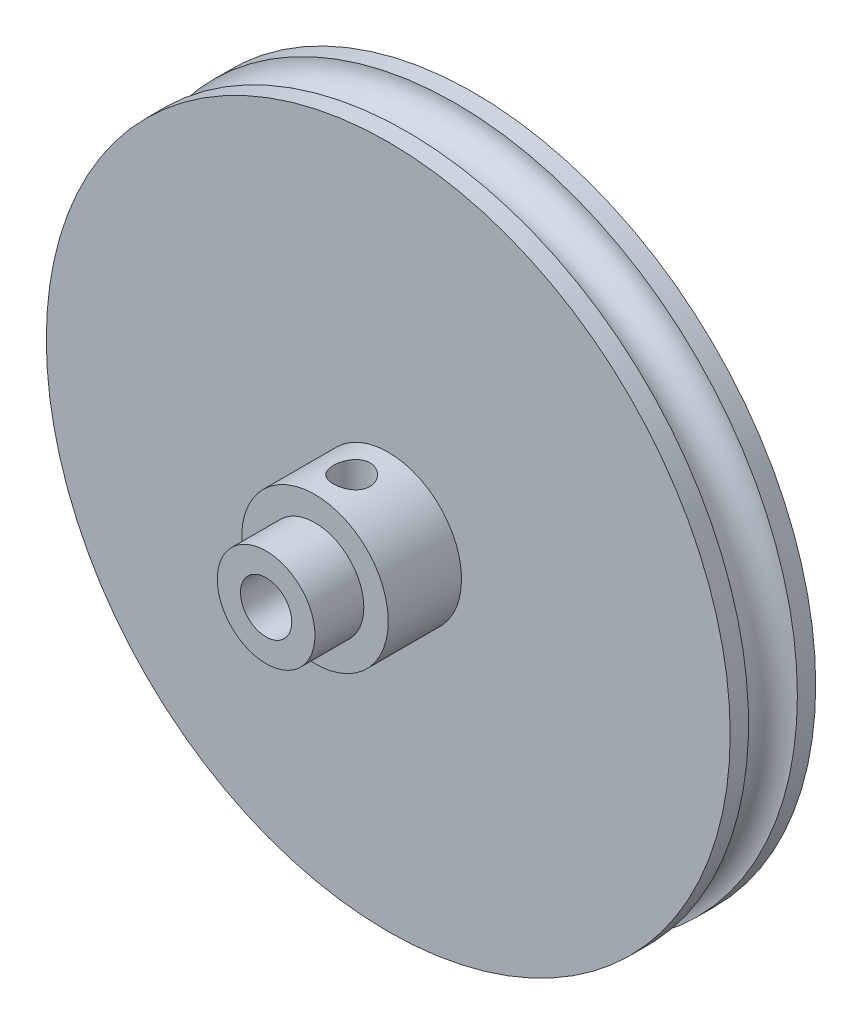
ISO-10303-21;
HEADER;
FILE_DESCRIPTION(('STEP AP214'),'2;1');
FILE_NAME('part.step','',(''),(''),'','','');
FILE_SCHEMA(('AUTOMOTIVE_DESIGN { 1 0 10303 214 1 1 1 1 }'));
ENDSEC;
DATA;
#1=APPLICATION_CONTEXT('core data for automotive mechanical design processes');
#2=APPLICATION_PROTOCOL_DEFINITION('international standard','automotive_design',2000,#1);
#3=PRODUCT_CONTEXT('',#1,'mechanical');
#4=PRODUCT('Part','Part','',(#3));
#5=PRODUCT_RELATED_PRODUCT_CATEGORY('part','',(#4));
#6=PRODUCT_DEFINITION_FORMATION('','',#4);
#7=PRODUCT_DEFINITION_CONTEXT('part definition',#1,'design');
#8=PRODUCT_DEFINITION('design','',#6,#7);
#9=PRODUCT_DEFINITION_SHAPE('','',#8);
#10=(LENGTH_UNIT() NAMED_UNIT(*) SI_UNIT(.MILLI.,.METRE.));
#11=(NAMED_UNIT(*) PLANE_ANGLE_UNIT() SI_UNIT($,.RADIAN.));
#12=(NAMED_UNIT(*) SI_UNIT($,.STERADIAN.) SOLID_ANGLE_UNIT());
#13=UNCERTAINTY_MEASURE_WITH_UNIT(LENGTH_MEASURE(1.E-05),#10,'distance_accuracy_value','');
#14=(GEOMETRIC_REPRESENTATION_CONTEXT(3) GLOBAL_UNCERTAINTY_ASSIGNED_CONTEXT((#13)) GLOBAL_UNIT_ASSIGNED_CONTEXT((#10,
#11,#12)) REPRESENTATION_CONTEXT('',''));
#15=CARTESIAN_POINT('',(0.,0.,0.));
#16=DIRECTION('',(0.,0.,1.));
#17=DIRECTION('',(1.,0.,0.));
#18=AXIS2_PLACEMENT_3D('',#15,#16,#17);
#19=CARTESIAN_POINT('',(0.,0.,0.));
#20=DIRECTION('',(0.,0.,1.));
#21=DIRECTION('',(1.,0.,0.));
#22=AXIS2_PLACEMENT_3D('',#19,#20,#21);
#23=CYLINDRICAL_SURFACE('',#22,2.1);
#24=CARTESIAN_POINT('',(0.,0.,0.));
#25=DIRECTION('',(0.,0.,1.));
#26=DIRECTION('',(1.,0.,0.));
#27=AXIS2_PLACEMENT_3D('',#24,#25,#26);
#28=CIRCLE('',#27,2.1);
#29=CARTESIAN_POINT('',(2.1,0.,0.));
#30=VERTEX_POINT('',#29);
#31=EDGE_CURVE('E72',#30,#30,#28,.T.);
#32=ORIENTED_EDGE('',*,*,#31,.F.);
#33=EDGE_LOOP('',(#32));
#34=FACE_BOUND('',#33,.T.);
#35=CARTESIAN_POINT('',(0.,0.,17.));
#36=DIRECTION('',(0.,0.,1.));
#37=DIRECTION('',(1.,0.,0.));
#38=AXIS2_PLACEMENT_3D('',#35,#36,#37);
#39=CIRCLE('',#38,2.1);
#40=CARTESIAN_POINT('',(2.1,0.,17.));
#41=VERTEX_POINT('',#40);
#42=EDGE_CURVE('E60',#41,#41,#39,.T.);
#43=ORIENTED_EDGE('',*,*,#42,.T.);
#44=EDGE_LOOP('',(#43));
#45=FACE_BOUND('',#44,.T.);
#46=CARTESIAN_POINT('',(0.,2.1,8.5));
#47=CARTESIAN_POINT('',(-0.0742399871543125,2.10000151369632,8.4999983328154));
#48=CARTESIAN_POINT('',(-0.14847228780196,2.0960305657222,8.50554237877936));
#49=CARTESIAN_POINT('',(-0.294537510569103,2.08054007579461,8.52734752510382));
#50=CARTESIAN_POINT('',(-0.36636937442685,2.06901724946753,8.54361328844457));
#51=CARTESIAN_POINT('',(-0.50528075991223,2.03953798236433,8.58580730876702));
#52=CARTESIAN_POINT('',(-0.572382093189151,2.02161374748366,8.61168722208121));
#53=CARTESIAN_POINT('',(-0.700940346431811,1.98071681938224,8.67194572495396));
#54=CARTESIAN_POINT('',(-0.762396508800771,1.95774344995381,8.70632545293122));
#55=CARTESIAN_POINT('',(-0.884158454498674,1.90604858079968,8.78590735169895));
#56=CARTESIAN_POINT('',(-0.943867292555755,1.87699641663021,8.8318033956452));
#57=CARTESIAN_POINT('',(-1.05527082397682,1.81670725523487,8.93135802863467));
#58=CARTESIAN_POINT('',(-1.10695327031243,1.78546702271467,8.98502824333768));
#59=CARTESIAN_POINT('',(-1.21060137903401,1.71725277223226,9.10994386142664));
#60=CARTESIAN_POINT('',(-1.26087106387615,1.6802808930462,9.18260623445379));
#61=CARTESIAN_POINT('',(-1.34855873776776,1.61074875287383,9.33723290190451));
#62=CARTESIAN_POINT('',(-1.38599721054951,1.57818151113002,9.41918208989052));
#63=CARTESIAN_POINT('',(-1.43652136520738,1.53205163132706,9.56383551655094));
#64=CARTESIAN_POINT('',(-1.45356662497443,1.51574445703128,9.62427010011254));
#65=CARTESIAN_POINT('',(-1.48005230154604,1.48989690052004,9.74813125986272));
#66=CARTESIAN_POINT('',(-1.48950884665266,1.48034217251357,9.81155118576373));
#67=CARTESIAN_POINT('',(-1.50020552985074,1.46950664613977,9.94023918165237));
#68=CARTESIAN_POINT('',(-1.50139229875544,1.4682795919234,10.0055165312642));
#69=CARTESIAN_POINT('',(-1.49530198035969,1.47447819447096,10.1352791024719));
#70=CARTESIAN_POINT('',(-1.48801790144054,1.48191099886764,10.1997636252687));
#71=CARTESIAN_POINT('',(-1.46411936401694,1.50554403866107,10.3340474341866));
#72=CARTESIAN_POINT('',(-1.44643072329694,1.52274402363615,10.4034716403027));
#73=CARTESIAN_POINT('',(-1.4021917385744,1.56357256020827,10.5374588371673));
#74=CARTESIAN_POINT('',(-1.37562175610307,1.58721533654268,10.6020106628682));
#75=CARTESIAN_POINT('',(-1.30511742817236,1.64601588118791,10.7448735997179));
#76=CARTESIAN_POINT('',(-1.25835357558366,1.68247147274397,10.8212487194466));
#77=CARTESIAN_POINT('',(-1.15248477752396,1.7566939000375,10.9642087692087));
#78=CARTESIAN_POINT('',(-1.09336770173586,1.79446199397487,11.0307839658066));
#79=CARTESIAN_POINT('',(-0.962800834327989,1.86780118446223,11.1537461025634));
#80=CARTESIAN_POINT('',(-0.891235370375023,1.90334699446249,11.2100263003869));
#81=CARTESIAN_POINT('',(-0.737122627440594,1.96814501690765,11.3095868466926));
#82=CARTESIAN_POINT('',(-0.654601115677322,1.99741158728469,11.3528969440433));
#83=CARTESIAN_POINT('',(-0.502786762492052,2.04003552659874,11.4149591141148));
#84=CARTESIAN_POINT('',(-0.43550293337276,2.05554723038274,11.4371586283004));
#85=CARTESIAN_POINT('',(-0.297347607907105,2.08002166700399,11.4719529373133));
#86=CARTESIAN_POINT('',(-0.226478758682597,2.08898915863501,11.4845547116779));
#87=CARTESIAN_POINT('',(-0.0828808130577237,2.09960209594909,11.4994521079923));
#88=CARTESIAN_POINT('',(-0.0101465457777145,2.10122431355105,11.5017150354395));
#89=CARTESIAN_POINT('',(0.134662144507583,2.09692955045279,11.4956998283681));
#90=CARTESIAN_POINT('',(0.206736496598425,2.09101176886314,11.4874205740719));
#91=CARTESIAN_POINT('',(0.344652982451686,2.07263811534357,11.4614742561572));
#92=CARTESIAN_POINT('',(0.410628443822303,2.06050712104557,11.4442731782697));
#93=CARTESIAN_POINT('',(0.538540725972048,2.03083469907945,11.4016147128666));
#94=CARTESIAN_POINT('',(0.600476724637224,2.01329217419011,11.3761556509397));
#95=CARTESIAN_POINT('',(0.724729922862117,1.97216386451729,11.3152870706117));
#96=CARTESIAN_POINT('',(0.786570692260155,1.94817387755705,11.2791837539811));
#97=CARTESIAN_POINT('',(0.903575664869074,1.89674553679489,11.1994056236057));
#98=CARTESIAN_POINT('',(0.958734635088281,1.86930451408402,11.1557249397661));
#99=CARTESIAN_POINT('',(1.07130953790488,1.80751918651238,11.053139475002));
#100=CARTESIAN_POINT('',(1.12732700599567,1.7728243678149,10.9929101524553));
#101=CARTESIAN_POINT('',(1.22898063188699,1.70392904766121,10.8639189512719));
#102=CARTESIAN_POINT('',(1.27461125255647,1.66972881892082,10.7951525516436));
#103=CARTESIAN_POINT('',(1.34840655881998,1.61049068369465,10.6608502607182));
#104=CARTESIAN_POINT('',(1.3781826574188,1.58485448207674,10.5964683129876));
#105=CARTESIAN_POINT('',(1.42875227353067,1.5394240379246,10.4623595209991));
#106=CARTESIAN_POINT('',(1.44956479313556,1.51961746555234,10.3926443561844));
#107=CARTESIAN_POINT('',(1.4780823346379,1.49184341447738,10.2623907137056));
#108=CARTESIAN_POINT('',(1.48750670349303,1.4823579407629,10.2025615644356));
#109=CARTESIAN_POINT('',(1.49901279618901,1.47072540809102,10.0815181759182));
#110=CARTESIAN_POINT('',(1.50110270525938,1.46857016870271,10.02030555748));
#111=CARTESIAN_POINT('',(1.49779304937287,1.47194411498406,9.89830492771636));
#112=CARTESIAN_POINT('',(1.49239297729272,1.47747382097746,9.83751694542176));
#113=CARTESIAN_POINT('',(1.47449551867843,1.49533169466967,9.71799156146261));
#114=CARTESIAN_POINT('',(1.46198715244103,1.50767037888344,9.65925748166075));
#115=CARTESIAN_POINT('',(1.42521014636684,1.54259872476081,9.52557578610495));
#116=CARTESIAN_POINT('',(1.39839283351165,1.56724515694173,9.45187734889083));
#117=CARTESIAN_POINT('',(1.33469997861311,1.62183051991132,9.31110860328652));
#118=CARTESIAN_POINT('',(1.2978077170184,1.65177821892023,9.24404956740886));
#119=CARTESIAN_POINT('',(1.21375615645452,1.71453266330322,9.11520341191946));
#120=CARTESIAN_POINT('',(1.1663473765118,1.74739464555719,9.05360662423695));
#121=CARTESIAN_POINT('',(1.06240230609339,1.81247541609043,8.93824127673774));
#122=CARTESIAN_POINT('',(1.00586287927558,1.84469397906931,8.88447541892804));
#123=CARTESIAN_POINT('',(0.873603136327682,1.91133354237187,8.77719467466611));
#124=CARTESIAN_POINT('',(0.796256196228744,1.94518702963912,8.72529915603061));
#125=CARTESIAN_POINT('',(0.630875696670568,2.00491356473176,8.63589529742952));
#126=CARTESIAN_POINT('',(0.542860755389264,2.03080024477001,8.59836235418694));
#127=CARTESIAN_POINT('',(0.37908151300842,2.06681366995399,8.54673596947779));
#128=CARTESIAN_POINT('',(0.304852347827541,2.07914974133551,8.52931026283795));
#129=CARTESIAN_POINT('',(0.153744270008506,2.09573818287287,8.50594874121106));
#130=CARTESIAN_POINT('',(0.0768680148396481,2.09999843272021,8.50000172620141));
#131=CARTESIAN_POINT('',(0.,2.1,8.5));
#132=B_SPLINE_CURVE_WITH_KNOTS('',3,(#46,#47,#48,#49,#50,#51,#52,#53,#54,#55,#56,#57,#58,#59,
#60,#61,#62,#63,#64,#65,#66,#67,#68,#69,#70,#71,#72,#73,#74,#75,#76,#77,#78,#79,#80,#81,#82,#83,
#84,#85,#86,#87,#88,#89,#90,#91,#92,#93,#94,#95,#96,#97,#98,#99,#100,#101,#102,#103,#104,#105,
#106,#107,#108,#109,#110,#111,#112,#113,#114,#115,#116,#117,#118,#119,#120,#121,#122,#123,#124,
#125,#126,#127,#128,#129,#130,#131),.UNSPECIFIED.,.T.,.F.,(4,2,2,2,2,2,2,2,2,2,2,2,2,2,2,2,2,2,
2,2,2,2,2,2,2,2,2,2,2,2,2,2,2,2,2,2,2,2,2,2,2,2,4),(0.,0.222407137033424,0.444911064992703,
0.666310976308092,0.887740556796045,1.12901917175521,1.37066239795699,1.65674641323183,
1.94237157348726,2.13628403403777,2.32978327261918,2.52453011590945,2.7194378123579,
2.93927374942446,3.1595990404321,3.4482078819463,3.73710146762558,4.02883886432737,
4.31990190033579,4.53657909767286,4.75309857512989,4.97030227966831,5.18752905724044,
5.39440800172806,5.60132891979957,5.82704593329478,6.05293859435066,6.31971670046752,
6.58663669215808,6.81214633204463,7.03717552727382,7.22029125711348,7.40320256538924,
7.58612625862381,7.76933327276093,8.01461476402193,8.2603058040042,8.51260573354359,
8.76499251219979,9.06059540426992,9.35568963348344,9.58619480297342,9.81647494936399),.UNSPECIFIED.);
#133=CARTESIAN_POINT('',(0.,2.1,8.5));
#134=VERTEX_POINT('',#133);
#135=EDGE_CURVE('E129',#134,#134,#132,.T.);
#136=ORIENTED_EDGE('',*,*,#135,.T.);
#137=EDGE_LOOP('',(#136));
#138=FACE_BOUND('',#137,.T.);
#139=ADVANCED_FACE('F37',(#34,#45,#138),#23,.F.);
#140=CARTESIAN_POINT('',(0.,0.,13.));
#141=DIRECTION('',(0.,0.,-1.));
#142=DIRECTION('',(-1.,0.,0.));
#143=AXIS2_PLACEMENT_3D('',#140,#141,#142);
#144=CYLINDRICAL_SURFACE('',#143,6.);
#145=CARTESIAN_POINT('',(0.,0.,13.));
#146=DIRECTION('',(0.,0.,1.));
#147=DIRECTION('',(1.,0.,0.));
#148=AXIS2_PLACEMENT_3D('',#145,#146,#147);
#149=CIRCLE('',#148,6.);
#150=CARTESIAN_POINT('',(6.,0.,13.));
#151=VERTEX_POINT('',#150);
#152=EDGE_CURVE('E56',#151,#151,#149,.T.);
#153=ORIENTED_EDGE('',*,*,#152,.F.);
#154=EDGE_LOOP('',(#153));
#155=FACE_BOUND('',#154,.T.);
#156=CARTESIAN_POINT('',(0.,0.,7.));
#157=DIRECTION('',(0.,0.,1.));
#158=DIRECTION('',(1.,0.,0.));
#159=AXIS2_PLACEMENT_3D('',#156,#157,#158);
#160=CIRCLE('',#159,6.);
#161=CARTESIAN_POINT('',(6.,0.,7.));
#162=VERTEX_POINT('',#161);
#163=EDGE_CURVE('E62',#162,#162,#160,.T.);
#164=ORIENTED_EDGE('',*,*,#163,.T.);
#165=EDGE_LOOP('',(#164));
#166=FACE_BOUND('',#165,.T.);
#167=CARTESIAN_POINT('',(0.,6.,8.5));
#168=CARTESIAN_POINT('',(0.0828760886697311,5.99999859868013,8.50000232573816));
#169=CARTESIAN_POINT('',(0.165778157830763,5.99826578131828,8.50689155077379));
#170=CARTESIAN_POINT('',(0.329206323770533,5.99152113829892,8.53422515130701));
#171=CARTESIAN_POINT('',(0.409731046870739,5.98650745419968,8.55467720953785));
#172=CARTESIAN_POINT('',(0.566020872182577,5.9737562633204,8.60843925346209));
#173=CARTESIAN_POINT('',(0.641791563430003,5.96602202842087,8.64173379871528));
#174=CARTESIAN_POINT('',(0.786672131904427,5.94865343807593,8.72018139004483));
#175=CARTESIAN_POINT('',(0.855781784348759,5.9390190185405,8.76533483611894));
#176=CARTESIAN_POINT('',(0.98680192730092,5.91867413591801,8.86720078965421));
#177=CARTESIAN_POINT('',(1.04855569006107,5.90794707148533,8.92411157495918));
#178=CARTESIAN_POINT('',(1.1617489272033,5.8867362011753,9.04745220490892));
#179=CARTESIAN_POINT('',(1.21318723694913,5.87625242288348,9.1138831229465));
#180=CARTESIAN_POINT('',(1.30502654279903,5.8565477569971,9.25559522673744));
#181=CARTESIAN_POINT('',(1.34525221592536,5.84734794470605,9.3309932308104));
#182=CARTESIAN_POINT('',(1.41239690855053,5.83149494812223,9.48774841165836));
#183=CARTESIAN_POINT('',(1.43931805543933,5.82484135672789,9.56910463332576));
#184=CARTESIAN_POINT('',(1.47855483680429,5.81500476717551,9.73374349820247));
#185=CARTESIAN_POINT('',(1.49115226833334,5.81175491075426,9.8169548960498));
#186=CARTESIAN_POINT('',(1.50226177506785,5.80889362537741,9.98436856901398));
#187=CARTESIAN_POINT('',(1.50077614181798,5.80928160448644,10.0685706806986));
#188=CARTESIAN_POINT('',(1.48398652463928,5.81359205496618,10.2334158077445));
#189=CARTESIAN_POINT('',(1.46901834019052,5.81742863001879,10.3140956214651));
#190=CARTESIAN_POINT('',(1.42622418690311,5.82806709676484,10.4717610509113));
#191=CARTESIAN_POINT('',(1.39839730206942,5.83486919970696,10.548746403029));
#192=CARTESIAN_POINT('',(1.33038947793716,5.85075113904187,10.6977380162521));
#193=CARTESIAN_POINT('',(1.29008666723291,5.85985327469421,10.7696861717895));
#194=CARTESIAN_POINT('',(1.19835627601496,5.87929710846386,10.9059187097568));
#195=CARTESIAN_POINT('',(1.14692674880884,5.88963902334735,10.9702017480673));
#196=CARTESIAN_POINT('',(1.03266342468122,5.91075880539781,11.0912036156944));
#197=CARTESIAN_POINT('',(0.96954625816586,5.92154069477971,11.1476544900614));
#198=CARTESIAN_POINT('',(0.8346119175037,5.94205965578786,11.2492212424639));
#199=CARTESIAN_POINT('',(0.762794477707944,5.95179669549415,11.2943367742636));
#200=CARTESIAN_POINT('',(0.612115888681392,5.96917732094182,11.3720505862244));
#201=CARTESIAN_POINT('',(0.533231393208624,5.97681360127725,11.4046053402544));
#202=CARTESIAN_POINT('',(0.370876008142883,5.98907916991419,11.4559173057096));
#203=CARTESIAN_POINT('',(0.287405999150485,5.99370903339281,11.4746771564181));
#204=CARTESIAN_POINT('',(0.120539970390027,5.99935499271375,11.4974575655588));
#205=CARTESIAN_POINT('',(0.0371967199882099,6.00046053508279,11.5018430260753));
#206=CARTESIAN_POINT('',(-0.129032874801508,5.99918804814451,11.4967509979445));
#207=CARTESIAN_POINT('',(-0.211919259644595,5.99681033241847,11.4872747572009));
#208=CARTESIAN_POINT('',(-0.373614268776491,5.98889581127357,11.4550290916086));
#209=CARTESIAN_POINT('',(-0.452465118968754,5.98340634185811,11.432458736523));
#210=CARTESIAN_POINT('',(-0.605257292452511,5.96988706634134,11.3748929159716));
#211=CARTESIAN_POINT('',(-0.679198119032634,5.96185700369892,11.3398961956868));
#212=CARTESIAN_POINT('',(-0.821523134429847,5.9439330792631,11.2577638711253));
#213=CARTESIAN_POINT('',(-0.88978544183583,5.93400867366932,11.2104238876032));
#214=CARTESIAN_POINT('',(-1.01752661364325,5.91344509187419,11.105210091203));
#215=CARTESIAN_POINT('',(-1.07700395897301,5.90280579251705,11.0473344603831));
#216=CARTESIAN_POINT('',(-1.18699056807273,5.88168956960771,10.9209980391555));
#217=CARTESIAN_POINT('',(-1.23724386762203,5.87122304187281,10.8523122969976));
#218=CARTESIAN_POINT('',(-1.3255107590127,5.85192878377239,10.7072673655343));
#219=CARTESIAN_POINT('',(-1.36352489415794,5.84310098067026,10.6309085170402));
#220=CARTESIAN_POINT('',(-1.42595142060929,5.82818094734665,10.4730942775869));
#221=CARTESIAN_POINT('',(-1.45044439665406,5.82207255291906,10.391672371656));
#222=CARTESIAN_POINT('',(-1.48534565995378,5.81326744090184,10.2256903621109));
#223=CARTESIAN_POINT('',(-1.49575702747866,5.81056997719936,10.1411309489675));
#224=CARTESIAN_POINT('',(-1.50203859033399,5.80894901203957,9.9738789761448));
#225=CARTESIAN_POINT('',(-1.49831789778012,5.80991932728264,9.89120256487527));
#226=CARTESIAN_POINT('',(-1.47737727831287,5.81527909007843,9.72769611133202));
#227=CARTESIAN_POINT('',(-1.46015762268677,5.81966846891857,9.64686603198635));
#228=CARTESIAN_POINT('',(-1.41293131944279,5.83131260682723,9.48979154093459));
#229=CARTESIAN_POINT('',(-1.38300140468038,5.8385501523631,9.41352269475979));
#230=CARTESIAN_POINT('',(-1.31126491360507,5.85507755724829,9.26703461728631));
#231=CARTESIAN_POINT('',(-1.26945669003419,5.86436770120773,9.19681622681308));
#232=CARTESIAN_POINT('',(-1.17386774863714,5.88425634263512,9.06244537099798));
#233=CARTESIAN_POINT('',(-1.11980316291225,5.89488264831757,8.99849892657604));
#234=CARTESIAN_POINT('',(-1.00178937118973,5.91608027246286,8.88045295520459));
#235=CARTESIAN_POINT('',(-0.937837821261145,5.9266515772706,8.82635576988703));
#236=CARTESIAN_POINT('',(-0.800467586702589,5.94677655647663,8.72858869143539));
#237=CARTESIAN_POINT('',(-0.726898422316385,5.95630833365868,8.68512538632842));
#238=CARTESIAN_POINT('',(-0.573266059510475,5.97304924975118,8.61125253705947));
#239=CARTESIAN_POINT('',(-0.493207563436739,5.98026005199781,8.58083363935146));
#240=CARTESIAN_POINT('',(-0.344410253243472,5.99048059565542,8.53842816967035));
#241=CARTESIAN_POINT('',(-0.276380170908068,5.99402585052691,8.52404875694657));
#242=CARTESIAN_POINT('',(-0.138906071536283,5.99878605231948,8.50483405637806));
#243=CARTESIAN_POINT('',(-0.0694621612426162,6.00000117450894,8.4999980506947));
#244=CARTESIAN_POINT('',(0.,6.,8.5));
#245=B_SPLINE_CURVE_WITH_KNOTS('',3,(#167,#168,#169,#170,#171,#172,#173,#174,#175,#176,#177,
#178,#179,#180,#181,#182,#183,#184,#185,#186,#187,#188,#189,#190,#191,#192,#193,#194,#195,#196,
#197,#198,#199,#200,#201,#202,#203,#204,#205,#206,#207,#208,#209,#210,#211,#212,#213,#214,#215,
#216,#217,#218,#219,#220,#221,#222,#223,#224,#225,#226,#227,#228,#229,#230,#231,#232,#233,#234,
#235,#236,#237,#238,#239,#240,#241,#242,#243,#244),.UNSPECIFIED.,.T.,.F.,(4,2,2,2,2,2,2,2,2,2,2,
2,2,2,2,2,2,2,2,2,2,2,2,2,2,2,2,2,2,2,2,2,2,2,2,2,2,2,4),(0.,0.24837371247189,0.4968882377639,
0.745104902286106,0.993329940169327,1.24614435437139,1.49898729580062,1.75558647545807,
2.01214461169368,2.2635629509943,2.51494038112697,2.76022497007018,3.00552703466038,
3.25330527873879,3.50112690836163,3.75601500969019,4.01091089558247,4.26668229009114,
4.52240473688643,4.77158308949276,5.02073901112743,5.26620274514037,5.5116912732229,
5.76153587565352,6.01142363008019,6.26744509204476,6.52345518749508,6.77792254614036,
7.03233423252408,7.27943780398612,7.52653640956034,7.77216400559447,8.01782568136901,
8.2698957640991,8.52202569770418,8.77872185499588,9.0352336382135,9.24342242942149,
9.4515955604304),.UNSPECIFIED.);
#246=CARTESIAN_POINT('',(0.,6.,8.5));
#247=VERTEX_POINT('',#246);
#248=EDGE_CURVE('E125',#247,#247,#245,.T.);
#249=ORIENTED_EDGE('',*,*,#248,.T.);
#250=EDGE_LOOP('',(#249));
#251=FACE_BOUND('',#250,.T.);
#252=ADVANCED_FACE('F99',(#155,#166,#251),#144,.T.);
#253=CARTESIAN_POINT('',(0.,0.,7.));
#254=DIRECTION('',(0.,0.,1.));
#255=DIRECTION('',(1.,0.,0.));
#256=AXIS2_PLACEMENT_3D('',#253,#254,#255);
#257=PLANE('',#256);
#258=CARTESIAN_POINT('',(0.,0.,7.));
#259=DIRECTION('',(0.,0.,1.));
#260=DIRECTION('',(1.,0.,0.));
#261=AXIS2_PLACEMENT_3D('',#258,#259,#260);
#262=CIRCLE('',#261,28.);
#263=CARTESIAN_POINT('',(28.,0.,7.));
#264=VERTEX_POINT('',#263);
#265=EDGE_CURVE('E10',#264,#264,#262,.T.);
#266=ORIENTED_EDGE('',*,*,#265,.T.);
#267=EDGE_LOOP('',(#266));
#268=FACE_BOUND('',#267,.T.);
#269=ORIENTED_EDGE('',*,*,#163,.F.);
#270=EDGE_LOOP('',(#269));
#271=FACE_BOUND('',#270,.T.);
#272=ADVANCED_FACE('F105',(#268,#271),#257,.T.);
#273=CARTESIAN_POINT('',(0.,0.,7.));
#274=DIRECTION('',(0.,0.,-1.));
#275=DIRECTION('',(-1.,0.,0.));
#276=AXIS2_PLACEMENT_3D('',#273,#274,#275);
#277=CYLINDRICAL_SURFACE('',#276,28.);
#278=CARTESIAN_POINT('',(0.,0.,1.5));
#279=DIRECTION('',(0.,0.,1.));
#280=DIRECTION('',(1.,0.,0.));
#281=AXIS2_PLACEMENT_3D('',#278,#279,#280);
#282=CIRCLE('',#281,28.);
#283=CARTESIAN_POINT('',(28.,0.,1.5));
#284=VERTEX_POINT('',#283);
#285=EDGE_CURVE('E41',#284,#284,#282,.F.);
#286=ORIENTED_EDGE('',*,*,#285,.T.);
#287=EDGE_LOOP('',(#286));
#288=FACE_BOUND('',#287,.T.);
#289=CARTESIAN_POINT('',(0.,0.,0.));
#290=DIRECTION('',(0.,0.,1.));
#291=DIRECTION('',(1.,0.,0.));
#292=AXIS2_PLACEMENT_3D('',#289,#290,#291);
#293=CIRCLE('',#292,28.);
#294=CARTESIAN_POINT('',(28.,0.,0.));
#295=VERTEX_POINT('',#294);
#296=EDGE_CURVE('E45',#295,#295,#293,.T.);
#297=ORIENTED_EDGE('',*,*,#296,.T.);
#298=EDGE_LOOP('',(#297));
#299=FACE_BOUND('',#298,.T.);
#300=ADVANCED_FACE('F169',(#288,#299),#277,.T.);
#301=CARTESIAN_POINT('',(0.,0.,5.5));
#302=DIRECTION('',(0.,0.,-1.));
#303=DIRECTION('',(-1.,0.,0.));
#304=AXIS2_PLACEMENT_3D('',#301,#302,#303);
#305=CIRCLE('',#304,28.);
#306=CARTESIAN_POINT('',(-28.,0.,5.5));
#307=VERTEX_POINT('',#306);
#308=EDGE_CURVE('E54',#307,#307,#305,.F.);
#309=ORIENTED_EDGE('',*,*,#308,.T.);
#310=EDGE_LOOP('',(#309));
#311=FACE_BOUND('',#310,.T.);
#312=ORIENTED_EDGE('',*,*,#265,.F.);
#313=EDGE_LOOP('',(#312));
#314=FACE_BOUND('',#313,.T.);
#315=ADVANCED_FACE('F39',(#311,#314),#277,.T.);
#316=CARTESIAN_POINT('',(0.,0.,0.));
#317=DIRECTION('',(0.,0.,1.));
#318=DIRECTION('',(1.,0.,0.));
#319=AXIS2_PLACEMENT_3D('',#316,#317,#318);
#320=PLANE('',#319);
#321=ORIENTED_EDGE('',*,*,#31,.T.);
#322=EDGE_LOOP('',(#321));
#323=FACE_BOUND('',#322,.T.);
#324=ORIENTED_EDGE('',*,*,#296,.F.);
#325=EDGE_LOOP('',(#324));
#326=FACE_BOUND('',#325,.T.);
#327=ADVANCED_FACE('F89',(#323,#326),#320,.F.);
#328=CARTESIAN_POINT('',(0.,0.,17.));
#329=DIRECTION('',(0.,0.,-1.));
#330=DIRECTION('',(-1.,0.,0.));
#331=AXIS2_PLACEMENT_3D('',#328,#329,#330);
#332=CYLINDRICAL_SURFACE('',#331,4.);
#333=CARTESIAN_POINT('',(0.,0.,13.));
#334=DIRECTION('',(0.,0.,1.));
#335=DIRECTION('',(1.,0.,0.));
#336=AXIS2_PLACEMENT_3D('',#333,#334,#335);
#337=CIRCLE('',#336,4.);
#338=CARTESIAN_POINT('',(4.,0.,13.));
#339=VERTEX_POINT('',#338);
#340=EDGE_CURVE('E67',#339,#339,#337,.T.);
#341=ORIENTED_EDGE('',*,*,#340,.T.);
#342=EDGE_LOOP('',(#341));
#343=FACE_BOUND('',#342,.T.);
#344=CARTESIAN_POINT('',(0.,0.,17.));
#345=DIRECTION('',(0.,0.,1.));
#346=DIRECTION('',(1.,0.,0.));
#347=AXIS2_PLACEMENT_3D('',#344,#345,#346);
#348=CIRCLE('',#347,4.);
#349=CARTESIAN_POINT('',(4.,0.,17.));
#350=VERTEX_POINT('',#349);
#351=EDGE_CURVE('E50',#350,#350,#348,.T.);
#352=ORIENTED_EDGE('',*,*,#351,.F.);
#353=EDGE_LOOP('',(#352));
#354=FACE_BOUND('',#353,.T.);
#355=ADVANCED_FACE('F83',(#343,#354),#332,.T.);
#356=CARTESIAN_POINT('',(0.,0.,17.));
#357=DIRECTION('',(0.,0.,1.));
#358=DIRECTION('',(1.,0.,0.));
#359=AXIS2_PLACEMENT_3D('',#356,#357,#358);
#360=PLANE('',#359);
#361=ORIENTED_EDGE('',*,*,#42,.F.);
#362=EDGE_LOOP('',(#361));
#363=FACE_BOUND('',#362,.T.);
#364=ORIENTED_EDGE('',*,*,#351,.T.);
#365=EDGE_LOOP('',(#364));
#366=FACE_BOUND('',#365,.T.);
#367=ADVANCED_FACE('F79',(#363,#366),#360,.T.);
#368=CARTESIAN_POINT('',(0.,0.,3.5));
#369=DIRECTION('',(0.,0.,-1.));
#370=DIRECTION('',(-1.,0.,0.));
#371=AXIS2_PLACEMENT_3D('',#368,#369,#370);
#372=TOROIDAL_SURFACE('',#371,28.,2.);
#373=ORIENTED_EDGE('',*,*,#308,.F.);
#374=EDGE_LOOP('',(#373));
#375=FACE_BOUND('',#374,.T.);
#376=ORIENTED_EDGE('',*,*,#285,.F.);
#377=EDGE_LOOP('',(#376));
#378=FACE_BOUND('',#377,.T.);
#379=ADVANCED_FACE('F82',(#375,#378),#372,.F.);
#380=CARTESIAN_POINT('',(0.,0.,13.));
#381=DIRECTION('',(0.,0.,1.));
#382=DIRECTION('',(1.,0.,0.));
#383=AXIS2_PLACEMENT_3D('',#380,#381,#382);
#384=PLANE('',#383);
#385=ORIENTED_EDGE('',*,*,#152,.T.);
#386=EDGE_LOOP('',(#385));
#387=FACE_BOUND('',#386,.T.);
#388=ORIENTED_EDGE('',*,*,#340,.F.);
#389=EDGE_LOOP('',(#388));
#390=FACE_BOUND('',#389,.T.);
#391=ADVANCED_FACE('F111',(#387,#390),#384,.T.);
#392=CARTESIAN_POINT('',(0.,28.001,10.));
#393=DIRECTION('',(0.,-1.,0.));
#394=DIRECTION('',(0.,0.,-1.));
#395=AXIS2_PLACEMENT_3D('',#392,#393,#394);
#396=CYLINDRICAL_SURFACE('',#395,1.5);
#397=ORIENTED_EDGE('',*,*,#248,.F.);
#398=EDGE_LOOP('',(#397));
#399=FACE_BOUND('',#398,.T.);
#400=ORIENTED_EDGE('',*,*,#135,.F.);
#401=EDGE_LOOP('',(#400));
#402=FACE_BOUND('',#401,.T.);
#403=ADVANCED_FACE('F116',(#399,#402),#396,.F.);
#404=CLOSED_SHELL('',(#139,#252,#272,#300,#315,#327,#355,#367,#379,#391,#403));
#405=MANIFOLD_SOLID_BREP('B2',#404);
#406=ADVANCED_BREP_SHAPE_REPRESENTATION('',(#18,#405),#14);
#407=SHAPE_DEFINITION_REPRESENTATION(#9,#406);
ENDSEC;
END-ISO-10303-21;
